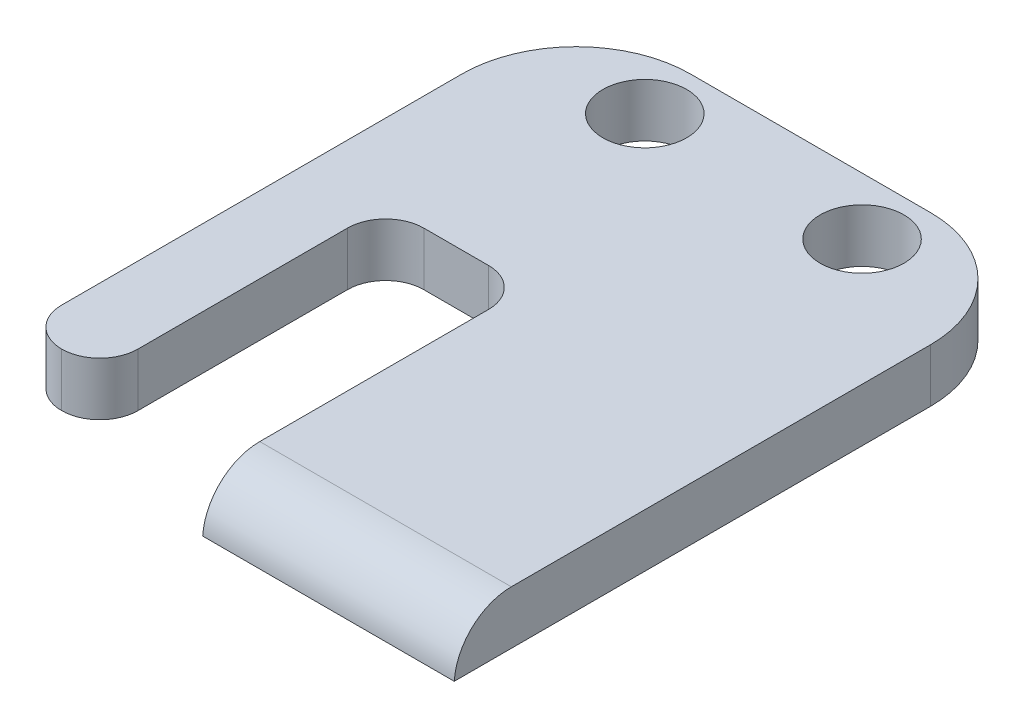
ISO-10303-21;
HEADER;
FILE_DESCRIPTION(('STEP AP214'),'2;1');
FILE_NAME('part.step','',(''),(''),'','','');
FILE_SCHEMA(('AUTOMOTIVE_DESIGN { 1 0 10303 214 1 1 1 1 }'));
ENDSEC;
DATA;
#1=APPLICATION_CONTEXT('core data for automotive mechanical design processes');
#2=APPLICATION_PROTOCOL_DEFINITION('international standard','automotive_design',2000,#1);
#3=PRODUCT_CONTEXT('',#1,'mechanical');
#4=PRODUCT('Part','Part','',(#3));
#5=PRODUCT_RELATED_PRODUCT_CATEGORY('part','',(#4));
#6=PRODUCT_DEFINITION_FORMATION('','',#4);
#7=PRODUCT_DEFINITION_CONTEXT('part definition',#1,'design');
#8=PRODUCT_DEFINITION('design','',#6,#7);
#9=PRODUCT_DEFINITION_SHAPE('','',#8);
#10=(LENGTH_UNIT() NAMED_UNIT(*) SI_UNIT(.MILLI.,.METRE.));
#11=(NAMED_UNIT(*) PLANE_ANGLE_UNIT() SI_UNIT($,.RADIAN.));
#12=(NAMED_UNIT(*) SI_UNIT($,.STERADIAN.) SOLID_ANGLE_UNIT());
#13=UNCERTAINTY_MEASURE_WITH_UNIT(LENGTH_MEASURE(1.E-05),#10,'distance_accuracy_value','');
#14=(GEOMETRIC_REPRESENTATION_CONTEXT(3) GLOBAL_UNCERTAINTY_ASSIGNED_CONTEXT((#13)) GLOBAL_UNIT_ASSIGNED_CONTEXT((#10,
#11,#12)) REPRESENTATION_CONTEXT('',''));
#15=CARTESIAN_POINT('',(0.,0.,0.));
#16=DIRECTION('',(0.,0.,1.));
#17=DIRECTION('',(1.,0.,0.));
#18=AXIS2_PLACEMENT_3D('',#15,#16,#17);
#19=CARTESIAN_POINT('',(0.,0.,0.));
#20=DIRECTION('',(0.,1.,0.));
#21=DIRECTION('',(0.,0.,1.));
#22=AXIS2_PLACEMENT_3D('',#19,#20,#21);
#23=PLANE('',#22);
#24=DIRECTION('',(0.,0.,-1.));
#25=VECTOR('',#24,1.);
#26=CARTESIAN_POINT('',(-12.6357076905754,0.,7.37612543632473));
#27=LINE('',#26,#25);
#28=CARTESIAN_POINT('',(-12.6357076905754,0.,20.3761254363247));
#29=VERTEX_POINT('',#28);
#30=CARTESIAN_POINT('',(-12.6357076905754,0.,9.37612543632473));
#31=VERTEX_POINT('',#30);
#32=EDGE_CURVE('E234',#29,#31,#27,.T.);
#33=ORIENTED_EDGE('',*,*,#32,.F.);
#34=CARTESIAN_POINT('',(-14.6357076905754,0.,20.3761254363247));
#35=DIRECTION('',(0.,1.,0.));
#36=DIRECTION('',(0.,0.,1.));
#37=AXIS2_PLACEMENT_3D('',#34,#35,#36);
#38=CIRCLE('',#37,2.);
#39=CARTESIAN_POINT('',(-14.6357076905754,0.,22.3761254363247));
#40=VERTEX_POINT('',#39);
#41=EDGE_CURVE('E312',#29,#40,#38,.F.);
#42=ORIENTED_EDGE('',*,*,#41,.T.);
#43=CARTESIAN_POINT('',(-14.6357076905754,0.,20.3761254363247));
#44=DIRECTION('',(0.,1.,0.));
#45=DIRECTION('',(0.,0.,1.));
#46=AXIS2_PLACEMENT_3D('',#43,#44,#45);
#47=CIRCLE('',#46,2.);
#48=CARTESIAN_POINT('',(-16.6357076905754,0.,20.3761254363247));
#49=VERTEX_POINT('',#48);
#50=EDGE_CURVE('E309',#40,#49,#47,.F.);
#51=ORIENTED_EDGE('',*,*,#50,.T.);
#52=DIRECTION('',(0.,0.,1.));
#53=VECTOR('',#52,1.);
#54=CARTESIAN_POINT('',(-16.6357076905754,0.,-6.62387456367526));
#55=LINE('',#54,#53);
#56=CARTESIAN_POINT('',(-16.6357076905754,0.,-0.623874563675265));
#57=VERTEX_POINT('',#56);
#58=EDGE_CURVE('E211',#57,#49,#55,.T.);
#59=ORIENTED_EDGE('',*,*,#58,.F.);
#60=CARTESIAN_POINT('',(-10.6357076905754,0.,-0.623874563675264));
#61=DIRECTION('',(0.,1.,0.));
#62=DIRECTION('',(0.,0.,1.));
#63=AXIS2_PLACEMENT_3D('',#60,#61,#62);
#64=CIRCLE('',#63,6.);
#65=CARTESIAN_POINT('',(-10.6357076905754,0.,-6.62387456367526));
#66=VERTEX_POINT('',#65);
#67=EDGE_CURVE('E275',#57,#66,#64,.F.);
#68=ORIENTED_EDGE('',*,*,#67,.T.);
#69=DIRECTION('',(-1.,0.,0.));
#70=VECTOR('',#69,1.);
#71=CARTESIAN_POINT('',(-16.6357076905754,0.,-6.62387456367526));
#72=LINE('',#71,#70);
#73=CARTESIAN_POINT('',(1.96429230942462,0.,-6.62387456367526));
#74=VERTEX_POINT('',#73);
#75=EDGE_CURVE('E254',#74,#66,#72,.T.);
#76=ORIENTED_EDGE('',*,*,#75,.F.);
#77=CARTESIAN_POINT('',(1.96429230942462,0.,-0.623874563675264));
#78=DIRECTION('',(0.,1.,0.));
#79=DIRECTION('',(0.,0.,1.));
#80=AXIS2_PLACEMENT_3D('',#77,#78,#79);
#81=CIRCLE('',#80,6.);
#82=CARTESIAN_POINT('',(7.96429230942462,0.,-0.623874563675264));
#83=VERTEX_POINT('',#82);
#84=EDGE_CURVE('E273',#74,#83,#81,.F.);
#85=ORIENTED_EDGE('',*,*,#84,.T.);
#86=DIRECTION('',(0.,0.,-1.));
#87=VECTOR('',#86,1.);
#88=CARTESIAN_POINT('',(7.96429230942462,0.,-6.62387456367526));
#89=LINE('',#88,#87);
#90=CARTESIAN_POINT('',(7.96429230942463,0.,24.3761254363247));
#91=VERTEX_POINT('',#90);
#92=EDGE_CURVE('E248',#91,#83,#89,.T.);
#93=ORIENTED_EDGE('',*,*,#92,.F.);
#94=DIRECTION('',(1.,0.,0.));
#95=VECTOR('',#94,1.);
#96=CARTESIAN_POINT('',(-5.23570769057537,0.,24.3761254363247));
#97=LINE('',#96,#95);
#98=CARTESIAN_POINT('',(-5.23570769057537,0.,24.3761254363247));
#99=VERTEX_POINT('',#98);
#100=EDGE_CURVE('E246',#99,#91,#97,.T.);
#101=ORIENTED_EDGE('',*,*,#100,.F.);
#102=DIRECTION('',(0.,0.,1.));
#103=VECTOR('',#102,1.);
#104=CARTESIAN_POINT('',(-5.23570769057537,0.,7.37612543632473));
#105=LINE('',#104,#103);
#106=CARTESIAN_POINT('',(-5.23570769057537,0.,9.37612543632473));
#107=VERTEX_POINT('',#106);
#108=EDGE_CURVE('E243',#107,#99,#105,.T.);
#109=ORIENTED_EDGE('',*,*,#108,.F.);
#110=CARTESIAN_POINT('',(-7.23570769057537,0.,9.37612543632473));
#111=DIRECTION('',(0.,1.,0.));
#112=DIRECTION('',(0.,0.,1.));
#113=AXIS2_PLACEMENT_3D('',#110,#111,#112);
#114=CIRCLE('',#113,2.);
#115=CARTESIAN_POINT('',(-7.23570769057537,0.,7.37612543632473));
#116=VERTEX_POINT('',#115);
#117=EDGE_CURVE('E321',#107,#116,#114,.T.);
#118=ORIENTED_EDGE('',*,*,#117,.T.);
#119=DIRECTION('',(1.,0.,0.));
#120=VECTOR('',#119,1.);
#121=CARTESIAN_POINT('',(-5.23570769057537,0.,7.37612543632473));
#122=LINE('',#121,#120);
#123=CARTESIAN_POINT('',(-10.6357076905754,0.,7.37612543632473));
#124=VERTEX_POINT('',#123);
#125=EDGE_CURVE('E238',#124,#116,#122,.T.);
#126=ORIENTED_EDGE('',*,*,#125,.F.);
#127=CARTESIAN_POINT('',(-10.6357076905754,0.,9.37612543632473));
#128=DIRECTION('',(0.,1.,0.));
#129=DIRECTION('',(0.,0.,1.));
#130=AXIS2_PLACEMENT_3D('',#127,#128,#129);
#131=CIRCLE('',#130,2.);
#132=EDGE_CURVE('E333',#124,#31,#131,.T.);
#133=ORIENTED_EDGE('',*,*,#132,.T.);
#134=EDGE_LOOP('',(#33,#42,#51,#59,#68,#76,#85,#93,#101,#109,#118,#126,#133));
#135=FACE_BOUND('',#134,.T.);
#136=CARTESIAN_POINT('',(1.36429230942463,0.,-3.62387456367527));
#137=DIRECTION('',(0.,1.,0.));
#138=DIRECTION('',(0.,0.,1.));
#139=AXIS2_PLACEMENT_3D('',#136,#137,#138);
#140=CIRCLE('',#139,2.2);
#141=CARTESIAN_POINT('',(1.36429230942463,0.,-1.42387456367527));
#142=VERTEX_POINT('',#141);
#143=EDGE_CURVE('E207',#142,#142,#140,.T.);
#144=ORIENTED_EDGE('',*,*,#143,.T.);
#145=EDGE_LOOP('',(#144));
#146=FACE_BOUND('',#145,.T.);
#147=CARTESIAN_POINT('',(-10.0357076905754,0.,-3.62387456367527));
#148=DIRECTION('',(0.,1.,0.));
#149=DIRECTION('',(0.,0.,1.));
#150=AXIS2_PLACEMENT_3D('',#147,#148,#149);
#151=CIRCLE('',#150,2.2);
#152=CARTESIAN_POINT('',(-10.0357076905754,0.,-1.42387456367527));
#153=VERTEX_POINT('',#152);
#154=EDGE_CURVE('E237',#153,#153,#151,.T.);
#155=ORIENTED_EDGE('',*,*,#154,.T.);
#156=EDGE_LOOP('',(#155));
#157=FACE_BOUND('',#156,.T.);
#158=DIRECTION('',(0.,0.,1.));
#159=VECTOR('',#158,1.);
#160=CARTESIAN_POINT('',(-3.03570769057537,0.,0.));
#161=LINE('',#160,#159);
#162=CARTESIAN_POINT('',(-3.03570769057537,0.,3.37612543632474));
#163=VERTEX_POINT('',#162);
#164=CARTESIAN_POINT('',(-3.03570769057537,0.,14.5761254363247));
#165=VERTEX_POINT('',#164);
#166=EDGE_CURVE('E584',#163,#165,#161,.T.);
#167=ORIENTED_EDGE('',*,*,#166,.T.);
#168=DIRECTION('',(1.,0.,0.));
#169=VECTOR('',#168,1.);
#170=CARTESIAN_POINT('',(0.,0.,14.5761254363247));
#171=LINE('',#170,#169);
#172=CARTESIAN_POINT('',(5.96429230942463,0.,14.5761254363247));
#173=VERTEX_POINT('',#172);
#174=EDGE_CURVE('E187',#165,#173,#171,.T.);
#175=ORIENTED_EDGE('',*,*,#174,.T.);
#176=DIRECTION('',(0.,0.,-1.));
#177=VECTOR('',#176,1.);
#178=CARTESIAN_POINT('',(5.96429230942463,0.,0.));
#179=LINE('',#178,#177);
#180=CARTESIAN_POINT('',(5.96429230942463,0.,3.37612543632474));
#181=VERTEX_POINT('',#180);
#182=EDGE_CURVE('E574',#173,#181,#179,.T.);
#183=ORIENTED_EDGE('',*,*,#182,.T.);
#184=DIRECTION('',(-1.,0.,0.));
#185=VECTOR('',#184,1.);
#186=CARTESIAN_POINT('',(0.,0.,3.37612543632474));
#187=LINE('',#186,#185);
#188=EDGE_CURVE('E185',#181,#163,#187,.T.);
#189=ORIENTED_EDGE('',*,*,#188,.T.);
#190=EDGE_LOOP('',(#167,#175,#183,#189));
#191=FACE_BOUND('',#190,.T.);
#192=ADVANCED_FACE('F43',(#135,#146,#157,#191),#23,.F.);
#193=CARTESIAN_POINT('',(-12.6357076905754,2.8,7.37612543632473));
#194=DIRECTION('',(-1.,0.,0.));
#195=DIRECTION('',(0.,0.,1.));
#196=AXIS2_PLACEMENT_3D('',#193,#194,#195);
#197=PLANE('',#196);
#198=ORIENTED_EDGE('',*,*,#32,.T.);
#199=DIRECTION('',(0.,-1.,0.));
#200=VECTOR('',#199,1.);
#201=CARTESIAN_POINT('',(-12.6357076905754,2.8,9.37612543632473));
#202=LINE('',#201,#200);
#203=CARTESIAN_POINT('',(-12.6357076905754,2.8,9.37612543632473));
#204=VERTEX_POINT('',#203);
#205=EDGE_CURVE('E310',#31,#204,#202,.F.);
#206=ORIENTED_EDGE('',*,*,#205,.T.);
#207=DIRECTION('',(0.,0.,-1.));
#208=VECTOR('',#207,1.);
#209=CARTESIAN_POINT('',(-12.6357076905754,2.8,7.37612543632473));
#210=LINE('',#209,#208);
#211=CARTESIAN_POINT('',(-12.6357076905754,2.8,20.3761254363247));
#212=VERTEX_POINT('',#211);
#213=EDGE_CURVE('E208',#212,#204,#210,.T.);
#214=ORIENTED_EDGE('',*,*,#213,.F.);
#215=DIRECTION('',(0.,-1.,0.));
#216=VECTOR('',#215,1.);
#217=CARTESIAN_POINT('',(-12.6357076905754,2.8,20.3761254363247));
#218=LINE('',#217,#216);
#219=EDGE_CURVE('E303',#212,#29,#218,.T.);
#220=ORIENTED_EDGE('',*,*,#219,.T.);
#221=EDGE_LOOP('',(#198,#206,#214,#220));
#222=FACE_BOUND('',#221,.T.);
#223=ADVANCED_FACE('F368',(#222),#197,.F.);
#224=CARTESIAN_POINT('',(-5.23570769057537,2.8,7.37612543632473));
#225=DIRECTION('',(0.,0.,-1.));
#226=DIRECTION('',(-1.,0.,0.));
#227=AXIS2_PLACEMENT_3D('',#224,#225,#226);
#228=PLANE('',#227);
#229=ORIENTED_EDGE('',*,*,#125,.T.);
#230=DIRECTION('',(0.,-1.,0.));
#231=VECTOR('',#230,1.);
#232=CARTESIAN_POINT('',(-7.23570769057537,2.8,7.37612543632473));
#233=LINE('',#232,#231);
#234=CARTESIAN_POINT('',(-7.23570769057537,2.8,7.37612543632473));
#235=VERTEX_POINT('',#234);
#236=EDGE_CURVE('E297',#116,#235,#233,.F.);
#237=ORIENTED_EDGE('',*,*,#236,.T.);
#238=DIRECTION('',(1.,0.,0.));
#239=VECTOR('',#238,1.);
#240=CARTESIAN_POINT('',(-5.23570769057537,2.8,7.37612543632473));
#241=LINE('',#240,#239);
#242=CARTESIAN_POINT('',(-10.6357076905754,2.8,7.37612543632473));
#243=VERTEX_POINT('',#242);
#244=EDGE_CURVE('E215',#243,#235,#241,.T.);
#245=ORIENTED_EDGE('',*,*,#244,.F.);
#246=DIRECTION('',(0.,-1.,0.));
#247=VECTOR('',#246,1.);
#248=CARTESIAN_POINT('',(-10.6357076905754,0.,7.37612543632473));
#249=LINE('',#248,#247);
#250=EDGE_CURVE('E298',#243,#124,#249,.T.);
#251=ORIENTED_EDGE('',*,*,#250,.T.);
#252=EDGE_LOOP('',(#229,#237,#245,#251));
#253=FACE_BOUND('',#252,.T.);
#254=ADVANCED_FACE('F359',(#253),#228,.F.);
#255=CARTESIAN_POINT('',(-5.23570769057537,2.8,7.37612543632473));
#256=DIRECTION('',(1.,0.,0.));
#257=DIRECTION('',(0.,0.,-1.));
#258=AXIS2_PLACEMENT_3D('',#255,#256,#257);
#259=PLANE('',#258);
#260=ORIENTED_EDGE('',*,*,#108,.T.);
#261=CARTESIAN_POINT('',(-5.23570769057537,-0.2,21.3827995269056));
#262=DIRECTION('',(1.,0.,0.));
#263=DIRECTION('',(0.,0.,-1.));
#264=AXIS2_PLACEMENT_3D('',#261,#262,#263);
#265=CIRCLE('',#264,3.);
#266=CARTESIAN_POINT('',(-5.23570769057537,2.8,21.3827995269056));
#267=VERTEX_POINT('',#266);
#268=EDGE_CURVE('E11',#99,#267,#265,.F.);
#269=ORIENTED_EDGE('',*,*,#268,.T.);
#270=DIRECTION('',(0.,0.,1.));
#271=VECTOR('',#270,1.);
#272=CARTESIAN_POINT('',(-5.23570769057537,2.8,7.37612543632473));
#273=LINE('',#272,#271);
#274=CARTESIAN_POINT('',(-5.23570769057537,2.8,9.37612543632473));
#275=VERTEX_POINT('',#274);
#276=EDGE_CURVE('E217',#275,#267,#273,.T.);
#277=ORIENTED_EDGE('',*,*,#276,.F.);
#278=DIRECTION('',(0.,-1.,0.));
#279=VECTOR('',#278,1.);
#280=CARTESIAN_POINT('',(-5.23570769057537,0.,9.37612543632473));
#281=LINE('',#280,#279);
#282=EDGE_CURVE('E292',#275,#107,#281,.T.);
#283=ORIENTED_EDGE('',*,*,#282,.T.);
#284=EDGE_LOOP('',(#260,#269,#277,#283));
#285=FACE_BOUND('',#284,.T.);
#286=ADVANCED_FACE('F352',(#285),#259,.F.);
#287=CARTESIAN_POINT('',(7.96429230942462,2.8,-6.62387456367526));
#288=DIRECTION('',(-1.,0.,0.));
#289=DIRECTION('',(0.,0.,1.));
#290=AXIS2_PLACEMENT_3D('',#287,#288,#289);
#291=PLANE('',#290);
#292=DIRECTION('',(0.,0.,-1.));
#293=VECTOR('',#292,1.);
#294=CARTESIAN_POINT('',(7.96429230942462,2.8,-6.62387456367526));
#295=LINE('',#294,#293);
#296=CARTESIAN_POINT('',(7.96429230942463,2.8,21.3827995269056));
#297=VERTEX_POINT('',#296);
#298=CARTESIAN_POINT('',(7.96429230942462,2.8,-0.623874563675264));
#299=VERTEX_POINT('',#298);
#300=EDGE_CURVE('E225',#297,#299,#295,.T.);
#301=ORIENTED_EDGE('',*,*,#300,.F.);
#302=CARTESIAN_POINT('',(7.96429230942463,-0.2,21.3827995269056));
#303=DIRECTION('',(-1.,0.,0.));
#304=DIRECTION('',(0.,0.,1.));
#305=AXIS2_PLACEMENT_3D('',#302,#303,#304);
#306=CIRCLE('',#305,3.);
#307=EDGE_CURVE('E55',#297,#91,#306,.F.);
#308=ORIENTED_EDGE('',*,*,#307,.T.);
#309=ORIENTED_EDGE('',*,*,#92,.T.);
#310=DIRECTION('',(0.,-1.,0.));
#311=VECTOR('',#310,1.);
#312=CARTESIAN_POINT('',(7.96429230942462,2.8,-0.623874563675264));
#313=LINE('',#312,#311);
#314=EDGE_CURVE('E277',#83,#299,#313,.F.);
#315=ORIENTED_EDGE('',*,*,#314,.T.);
#316=EDGE_LOOP('',(#301,#308,#309,#315));
#317=FACE_BOUND('',#316,.T.);
#318=ADVANCED_FACE('F344',(#317),#291,.F.);
#319=CARTESIAN_POINT('',(-16.6357076905754,2.8,-6.62387456367526));
#320=DIRECTION('',(0.,0.,1.));
#321=DIRECTION('',(1.,0.,0.));
#322=AXIS2_PLACEMENT_3D('',#319,#320,#321);
#323=PLANE('',#322);
#324=DIRECTION('',(-1.,0.,0.));
#325=VECTOR('',#324,1.);
#326=CARTESIAN_POINT('',(-16.6357076905754,2.8,-6.62387456367526));
#327=LINE('',#326,#325);
#328=CARTESIAN_POINT('',(1.96429230942462,2.8,-6.62387456367526));
#329=VERTEX_POINT('',#328);
#330=CARTESIAN_POINT('',(-10.6357076905754,2.8,-6.62387456367526));
#331=VERTEX_POINT('',#330);
#332=EDGE_CURVE('E224',#329,#331,#327,.T.);
#333=ORIENTED_EDGE('',*,*,#332,.F.);
#334=DIRECTION('',(0.,-1.,0.));
#335=VECTOR('',#334,1.);
#336=CARTESIAN_POINT('',(1.96429230942462,2.8,-6.62387456367526));
#337=LINE('',#336,#335);
#338=EDGE_CURVE('E266',#329,#74,#337,.T.);
#339=ORIENTED_EDGE('',*,*,#338,.T.);
#340=ORIENTED_EDGE('',*,*,#75,.T.);
#341=DIRECTION('',(0.,-1.,0.));
#342=VECTOR('',#341,1.);
#343=CARTESIAN_POINT('',(-10.6357076905754,2.8,-6.62387456367526));
#344=LINE('',#343,#342);
#345=EDGE_CURVE('E231',#66,#331,#344,.F.);
#346=ORIENTED_EDGE('',*,*,#345,.T.);
#347=EDGE_LOOP('',(#333,#339,#340,#346));
#348=FACE_BOUND('',#347,.T.);
#349=ADVANCED_FACE('F393',(#348),#323,.F.);
#350=CARTESIAN_POINT('',(-16.6357076905754,2.8,-6.62387456367526));
#351=DIRECTION('',(1.,0.,0.));
#352=DIRECTION('',(0.,0.,-1.));
#353=AXIS2_PLACEMENT_3D('',#350,#351,#352);
#354=PLANE('',#353);
#355=ORIENTED_EDGE('',*,*,#58,.T.);
#356=DIRECTION('',(0.,-1.,0.));
#357=VECTOR('',#356,1.);
#358=CARTESIAN_POINT('',(-16.6357076905754,2.8,20.3761254363247));
#359=LINE('',#358,#357);
#360=CARTESIAN_POINT('',(-16.6357076905754,2.8,20.3761254363247));
#361=VERTEX_POINT('',#360);
#362=EDGE_CURVE('E324',#49,#361,#359,.F.);
#363=ORIENTED_EDGE('',*,*,#362,.T.);
#364=DIRECTION('',(0.,0.,1.));
#365=VECTOR('',#364,1.);
#366=CARTESIAN_POINT('',(-16.6357076905754,2.8,-6.62387456367526));
#367=LINE('',#366,#365);
#368=CARTESIAN_POINT('',(-16.6357076905754,2.8,-0.623874563675265));
#369=VERTEX_POINT('',#368);
#370=EDGE_CURVE('E230',#369,#361,#367,.T.);
#371=ORIENTED_EDGE('',*,*,#370,.F.);
#372=DIRECTION('',(0.,-1.,0.));
#373=VECTOR('',#372,1.);
#374=CARTESIAN_POINT('',(-16.6357076905754,2.8,-0.623874563675264));
#375=LINE('',#374,#373);
#376=EDGE_CURVE('E286',#369,#57,#375,.T.);
#377=ORIENTED_EDGE('',*,*,#376,.T.);
#378=EDGE_LOOP('',(#355,#363,#371,#377));
#379=FACE_BOUND('',#378,.T.);
#380=ADVANCED_FACE('F384',(#379),#354,.F.);
#381=CARTESIAN_POINT('',(0.,2.8,0.));
#382=DIRECTION('',(0.,1.,0.));
#383=DIRECTION('',(0.,0.,1.));
#384=AXIS2_PLACEMENT_3D('',#381,#382,#383);
#385=PLANE('',#384);
#386=CARTESIAN_POINT('',(-10.0357076905754,2.8,-3.62387456367527));
#387=DIRECTION('',(0.,1.,0.));
#388=DIRECTION('',(0.,0.,1.));
#389=AXIS2_PLACEMENT_3D('',#386,#387,#388);
#390=CIRCLE('',#389,2.2);
#391=CARTESIAN_POINT('',(-10.0357076905754,2.8,-1.42387456367527));
#392=VERTEX_POINT('',#391);
#393=EDGE_CURVE('E205',#392,#392,#390,.T.);
#394=ORIENTED_EDGE('',*,*,#393,.F.);
#395=EDGE_LOOP('',(#394));
#396=FACE_BOUND('',#395,.T.);
#397=CARTESIAN_POINT('',(1.36429230942463,2.8,-3.62387456367527));
#398=DIRECTION('',(0.,1.,0.));
#399=DIRECTION('',(0.,0.,1.));
#400=AXIS2_PLACEMENT_3D('',#397,#398,#399);
#401=CIRCLE('',#400,2.2);
#402=CARTESIAN_POINT('',(1.36429230942463,2.8,-1.42387456367527));
#403=VERTEX_POINT('',#402);
#404=EDGE_CURVE('E191',#403,#403,#401,.T.);
#405=ORIENTED_EDGE('',*,*,#404,.F.);
#406=EDGE_LOOP('',(#405));
#407=FACE_BOUND('',#406,.T.);
#408=ORIENTED_EDGE('',*,*,#276,.T.);
#409=DIRECTION('',(-1.,0.,0.));
#410=VECTOR('',#409,1.);
#411=CARTESIAN_POINT('',(7.96429230942463,2.8,21.3827995269056));
#412=LINE('',#411,#410);
#413=EDGE_CURVE('E334',#267,#297,#412,.F.);
#414=ORIENTED_EDGE('',*,*,#413,.T.);
#415=ORIENTED_EDGE('',*,*,#300,.T.);
#416=CARTESIAN_POINT('',(1.96429230942462,2.8,-0.623874563675264));
#417=DIRECTION('',(0.,1.,0.));
#418=DIRECTION('',(0.,0.,1.));
#419=AXIS2_PLACEMENT_3D('',#416,#417,#418);
#420=CIRCLE('',#419,6.);
#421=EDGE_CURVE('E284',#299,#329,#420,.T.);
#422=ORIENTED_EDGE('',*,*,#421,.T.);
#423=ORIENTED_EDGE('',*,*,#332,.T.);
#424=CARTESIAN_POINT('',(-10.6357076905754,2.8,-0.623874563675264));
#425=DIRECTION('',(0.,1.,0.));
#426=DIRECTION('',(0.,0.,1.));
#427=AXIS2_PLACEMENT_3D('',#424,#425,#426);
#428=CIRCLE('',#427,6.);
#429=EDGE_CURVE('E285',#331,#369,#428,.T.);
#430=ORIENTED_EDGE('',*,*,#429,.T.);
#431=ORIENTED_EDGE('',*,*,#370,.T.);
#432=CARTESIAN_POINT('',(-14.6357076905754,2.8,20.3761254363247));
#433=DIRECTION('',(0.,1.,0.));
#434=DIRECTION('',(0.,0.,1.));
#435=AXIS2_PLACEMENT_3D('',#432,#433,#434);
#436=CIRCLE('',#435,2.);
#437=CARTESIAN_POINT('',(-14.6357076905754,2.8,22.3761254363247));
#438=VERTEX_POINT('',#437);
#439=EDGE_CURVE('E317',#361,#438,#436,.T.);
#440=ORIENTED_EDGE('',*,*,#439,.T.);
#441=CARTESIAN_POINT('',(-14.6357076905754,2.8,20.3761254363247));
#442=DIRECTION('',(0.,1.,0.));
#443=DIRECTION('',(0.,0.,1.));
#444=AXIS2_PLACEMENT_3D('',#441,#442,#443);
#445=CIRCLE('',#444,2.);
#446=EDGE_CURVE('E316',#438,#212,#445,.T.);
#447=ORIENTED_EDGE('',*,*,#446,.T.);
#448=ORIENTED_EDGE('',*,*,#213,.T.);
#449=CARTESIAN_POINT('',(-10.6357076905754,2.8,9.37612543632473));
#450=DIRECTION('',(0.,1.,0.));
#451=DIRECTION('',(0.,0.,1.));
#452=AXIS2_PLACEMENT_3D('',#449,#450,#451);
#453=CIRCLE('',#452,2.);
#454=EDGE_CURVE('E331',#204,#243,#453,.F.);
#455=ORIENTED_EDGE('',*,*,#454,.T.);
#456=ORIENTED_EDGE('',*,*,#244,.T.);
#457=CARTESIAN_POINT('',(-7.23570769057537,2.8,9.37612543632473));
#458=DIRECTION('',(0.,1.,0.));
#459=DIRECTION('',(0.,0.,1.));
#460=AXIS2_PLACEMENT_3D('',#457,#458,#459);
#461=CIRCLE('',#460,2.);
#462=EDGE_CURVE('E326',#235,#275,#461,.F.);
#463=ORIENTED_EDGE('',*,*,#462,.T.);
#464=EDGE_LOOP('',(#408,#414,#415,#422,#423,#430,#431,#440,#447,#448,#455,#456,#463));
#465=FACE_BOUND('',#464,.T.);
#466=ADVANCED_FACE('F353',(#396,#407,#465),#385,.T.);
#467=CARTESIAN_POINT('',(1.36429230942463,-3.2,-3.62387456367527));
#468=DIRECTION('',(0.,1.,0.));
#469=DIRECTION('',(0.,0.,1.));
#470=AXIS2_PLACEMENT_3D('',#467,#468,#469);
#471=CYLINDRICAL_SURFACE('',#470,2.2);
#472=ORIENTED_EDGE('',*,*,#404,.T.);
#473=EDGE_LOOP('',(#472));
#474=FACE_BOUND('',#473,.T.);
#475=ORIENTED_EDGE('',*,*,#143,.F.);
#476=EDGE_LOOP('',(#475));
#477=FACE_BOUND('',#476,.T.);
#478=ADVANCED_FACE('F401',(#474,#477),#471,.F.);
#479=CARTESIAN_POINT('',(-10.0357076905754,-3.2,-3.62387456367527));
#480=DIRECTION('',(0.,1.,0.));
#481=DIRECTION('',(0.,0.,1.));
#482=AXIS2_PLACEMENT_3D('',#479,#480,#481);
#483=CYLINDRICAL_SURFACE('',#482,2.2);
#484=ORIENTED_EDGE('',*,*,#393,.T.);
#485=EDGE_LOOP('',(#484));
#486=FACE_BOUND('',#485,.T.);
#487=ORIENTED_EDGE('',*,*,#154,.F.);
#488=EDGE_LOOP('',(#487));
#489=FACE_BOUND('',#488,.T.);
#490=ADVANCED_FACE('F400',(#486,#489),#483,.F.);
#491=CARTESIAN_POINT('',(1.96429230942462,2.8,-0.623874563675264));
#492=DIRECTION('',(0.,-1.,0.));
#493=DIRECTION('',(0.,0.,-1.));
#494=AXIS2_PLACEMENT_3D('',#491,#492,#493);
#495=CYLINDRICAL_SURFACE('',#494,6.);
#496=ORIENTED_EDGE('',*,*,#421,.F.);
#497=ORIENTED_EDGE('',*,*,#314,.F.);
#498=ORIENTED_EDGE('',*,*,#84,.F.);
#499=ORIENTED_EDGE('',*,*,#338,.F.);
#500=EDGE_LOOP('',(#496,#497,#498,#499));
#501=FACE_BOUND('',#500,.T.);
#502=ADVANCED_FACE('F394',(#501),#495,.T.);
#503=CARTESIAN_POINT('',(-10.6357076905754,2.8,-0.623874563675264));
#504=DIRECTION('',(0.,-1.,0.));
#505=DIRECTION('',(0.,0.,-1.));
#506=AXIS2_PLACEMENT_3D('',#503,#504,#505);
#507=CYLINDRICAL_SURFACE('',#506,6.);
#508=ORIENTED_EDGE('',*,*,#429,.F.);
#509=ORIENTED_EDGE('',*,*,#345,.F.);
#510=ORIENTED_EDGE('',*,*,#67,.F.);
#511=ORIENTED_EDGE('',*,*,#376,.F.);
#512=EDGE_LOOP('',(#508,#509,#510,#511));
#513=FACE_BOUND('',#512,.T.);
#514=ADVANCED_FACE('F390',(#513),#507,.T.);
#515=CARTESIAN_POINT('',(-7.23570769057537,2.8,9.37612543632473));
#516=DIRECTION('',(0.,1.,0.));
#517=DIRECTION('',(0.,0.,1.));
#518=AXIS2_PLACEMENT_3D('',#515,#516,#517);
#519=CYLINDRICAL_SURFACE('',#518,2.);
#520=ORIENTED_EDGE('',*,*,#462,.F.);
#521=ORIENTED_EDGE('',*,*,#236,.F.);
#522=ORIENTED_EDGE('',*,*,#117,.F.);
#523=ORIENTED_EDGE('',*,*,#282,.F.);
#524=EDGE_LOOP('',(#520,#521,#522,#523));
#525=FACE_BOUND('',#524,.T.);
#526=ADVANCED_FACE('F358',(#525),#519,.F.);
#527=CARTESIAN_POINT('',(-10.6357076905754,2.8,9.37612543632473));
#528=DIRECTION('',(0.,1.,0.));
#529=DIRECTION('',(0.,0.,1.));
#530=AXIS2_PLACEMENT_3D('',#527,#528,#529);
#531=CYLINDRICAL_SURFACE('',#530,2.);
#532=ORIENTED_EDGE('',*,*,#454,.F.);
#533=ORIENTED_EDGE('',*,*,#205,.F.);
#534=ORIENTED_EDGE('',*,*,#132,.F.);
#535=ORIENTED_EDGE('',*,*,#250,.F.);
#536=EDGE_LOOP('',(#532,#533,#534,#535));
#537=FACE_BOUND('',#536,.T.);
#538=ADVANCED_FACE('F362',(#537),#531,.F.);
#539=CARTESIAN_POINT('',(-14.6357076905754,2.8,20.3761254363247));
#540=DIRECTION('',(0.,-1.,0.));
#541=DIRECTION('',(0.,0.,-1.));
#542=AXIS2_PLACEMENT_3D('',#539,#540,#541);
#543=CYLINDRICAL_SURFACE('',#542,2.);
#544=DIRECTION('',(0.,-1.,0.));
#545=VECTOR('',#544,1.);
#546=CARTESIAN_POINT('',(-14.6357076905754,2.8,22.3761254363247));
#547=LINE('',#546,#545);
#548=EDGE_CURVE('E189',#438,#40,#547,.T.);
#549=ORIENTED_EDGE('',*,*,#548,.F.);
#550=ORIENTED_EDGE('',*,*,#439,.F.);
#551=ORIENTED_EDGE('',*,*,#362,.F.);
#552=ORIENTED_EDGE('',*,*,#50,.F.);
#553=EDGE_LOOP('',(#549,#550,#551,#552));
#554=FACE_BOUND('',#553,.T.);
#555=ADVANCED_FACE('F378',(#554),#543,.T.);
#556=CARTESIAN_POINT('',(-14.6357076905754,2.8,20.3761254363247));
#557=DIRECTION('',(0.,-1.,0.));
#558=DIRECTION('',(0.,0.,-1.));
#559=AXIS2_PLACEMENT_3D('',#556,#557,#558);
#560=CYLINDRICAL_SURFACE('',#559,2.);
#561=ORIENTED_EDGE('',*,*,#446,.F.);
#562=ORIENTED_EDGE('',*,*,#548,.T.);
#563=ORIENTED_EDGE('',*,*,#41,.F.);
#564=ORIENTED_EDGE('',*,*,#219,.F.);
#565=EDGE_LOOP('',(#561,#562,#563,#564));
#566=FACE_BOUND('',#565,.T.);
#567=ADVANCED_FACE('F373',(#566),#560,.T.);
#568=CARTESIAN_POINT('',(-3.03570769057537,2.2,0.));
#569=DIRECTION('',(1.,0.,0.));
#570=DIRECTION('',(0.,0.,-1.));
#571=AXIS2_PLACEMENT_3D('',#568,#569,#570);
#572=PLANE('',#571);
#573=ORIENTED_EDGE('',*,*,#166,.F.);
#574=DIRECTION('',(0.,-1.,0.));
#575=VECTOR('',#574,1.);
#576=CARTESIAN_POINT('',(-3.03570769057537,2.2,3.37612543632474));
#577=LINE('',#576,#575);
#578=CARTESIAN_POINT('',(-3.03570769057537,2.2,3.37612543632474));
#579=VERTEX_POINT('',#578);
#580=EDGE_CURVE('E179',#579,#163,#577,.T.);
#581=ORIENTED_EDGE('',*,*,#580,.F.);
#582=DIRECTION('',(0.,0.,1.));
#583=VECTOR('',#582,1.);
#584=CARTESIAN_POINT('',(-3.03570769057537,2.2,0.));
#585=LINE('',#584,#583);
#586=CARTESIAN_POINT('',(-3.03570769057537,2.2,14.5761254363247));
#587=VERTEX_POINT('',#586);
#588=EDGE_CURVE('E168',#579,#587,#585,.T.);
#589=ORIENTED_EDGE('',*,*,#588,.T.);
#590=DIRECTION('',(0.,-1.,0.));
#591=VECTOR('',#590,1.);
#592=CARTESIAN_POINT('',(-3.03570769057537,2.2,14.5761254363247));
#593=LINE('',#592,#591);
#594=EDGE_CURVE('E180',#587,#165,#593,.T.);
#595=ORIENTED_EDGE('',*,*,#594,.T.);
#596=EDGE_LOOP('',(#573,#581,#589,#595));
#597=FACE_BOUND('',#596,.T.);
#598=ADVANCED_FACE('F176',(#597),#572,.T.);
#599=CARTESIAN_POINT('',(0.,2.2,14.5761254363247));
#600=DIRECTION('',(0.,0.,-1.));
#601=DIRECTION('',(-1.,0.,0.));
#602=AXIS2_PLACEMENT_3D('',#599,#600,#601);
#603=PLANE('',#602);
#604=ORIENTED_EDGE('',*,*,#174,.F.);
#605=ORIENTED_EDGE('',*,*,#594,.F.);
#606=DIRECTION('',(1.,0.,0.));
#607=VECTOR('',#606,1.);
#608=CARTESIAN_POINT('',(0.,2.2,14.5761254363247));
#609=LINE('',#608,#607);
#610=CARTESIAN_POINT('',(5.96429230942463,2.2,14.5761254363247));
#611=VERTEX_POINT('',#610);
#612=EDGE_CURVE('E162',#587,#611,#609,.T.);
#613=ORIENTED_EDGE('',*,*,#612,.T.);
#614=DIRECTION('',(0.,-1.,0.));
#615=VECTOR('',#614,1.);
#616=CARTESIAN_POINT('',(5.96429230942463,2.2,14.5761254363247));
#617=LINE('',#616,#615);
#618=EDGE_CURVE('E186',#611,#173,#617,.T.);
#619=ORIENTED_EDGE('',*,*,#618,.T.);
#620=EDGE_LOOP('',(#604,#605,#613,#619));
#621=FACE_BOUND('',#620,.T.);
#622=ADVANCED_FACE('F183',(#621),#603,.T.);
#623=CARTESIAN_POINT('',(5.96429230942463,2.2,0.));
#624=DIRECTION('',(-1.,0.,0.));
#625=DIRECTION('',(0.,0.,1.));
#626=AXIS2_PLACEMENT_3D('',#623,#624,#625);
#627=PLANE('',#626);
#628=ORIENTED_EDGE('',*,*,#182,.F.);
#629=ORIENTED_EDGE('',*,*,#618,.F.);
#630=DIRECTION('',(0.,0.,-1.));
#631=VECTOR('',#630,1.);
#632=CARTESIAN_POINT('',(5.96429230942463,2.2,0.));
#633=LINE('',#632,#631);
#634=CARTESIAN_POINT('',(5.96429230942463,2.2,3.37612543632474));
#635=VERTEX_POINT('',#634);
#636=EDGE_CURVE('E170',#611,#635,#633,.T.);
#637=ORIENTED_EDGE('',*,*,#636,.T.);
#638=DIRECTION('',(0.,-1.,0.));
#639=VECTOR('',#638,1.);
#640=CARTESIAN_POINT('',(5.96429230942463,2.2,3.37612543632474));
#641=LINE('',#640,#639);
#642=EDGE_CURVE('E196',#635,#181,#641,.T.);
#643=ORIENTED_EDGE('',*,*,#642,.T.);
#644=EDGE_LOOP('',(#628,#629,#637,#643));
#645=FACE_BOUND('',#644,.T.);
#646=ADVANCED_FACE('F527',(#645),#627,.T.);
#647=CARTESIAN_POINT('',(0.,2.2,3.37612543632474));
#648=DIRECTION('',(0.,0.,1.));
#649=DIRECTION('',(1.,0.,0.));
#650=AXIS2_PLACEMENT_3D('',#647,#648,#649);
#651=PLANE('',#650);
#652=ORIENTED_EDGE('',*,*,#188,.F.);
#653=ORIENTED_EDGE('',*,*,#642,.F.);
#654=DIRECTION('',(-1.,0.,0.));
#655=VECTOR('',#654,1.);
#656=CARTESIAN_POINT('',(0.,2.2,3.37612543632474));
#657=LINE('',#656,#655);
#658=EDGE_CURVE('E590',#635,#579,#657,.T.);
#659=ORIENTED_EDGE('',*,*,#658,.T.);
#660=ORIENTED_EDGE('',*,*,#580,.T.);
#661=EDGE_LOOP('',(#652,#653,#659,#660));
#662=FACE_BOUND('',#661,.T.);
#663=ADVANCED_FACE('F540',(#662),#651,.T.);
#664=CARTESIAN_POINT('',(0.,2.2,0.));
#665=DIRECTION('',(0.,1.,0.));
#666=DIRECTION('',(0.,0.,1.));
#667=AXIS2_PLACEMENT_3D('',#664,#665,#666);
#668=PLANE('',#667);
#669=ORIENTED_EDGE('',*,*,#588,.F.);
#670=ORIENTED_EDGE('',*,*,#658,.F.);
#671=ORIENTED_EDGE('',*,*,#636,.F.);
#672=ORIENTED_EDGE('',*,*,#612,.F.);
#673=EDGE_LOOP('',(#669,#670,#671,#672));
#674=FACE_BOUND('',#673,.T.);
#675=ADVANCED_FACE('F165',(#674),#668,.F.);
#676=CARTESIAN_POINT('',(-5.23570769057537,-0.2,21.3827995269056));
#677=DIRECTION('',(1.,0.,0.));
#678=DIRECTION('',(0.,0.,-1.));
#679=AXIS2_PLACEMENT_3D('',#676,#677,#678);
#680=CYLINDRICAL_SURFACE('',#679,3.);
#681=ORIENTED_EDGE('',*,*,#268,.F.);
#682=ORIENTED_EDGE('',*,*,#100,.T.);
#683=ORIENTED_EDGE('',*,*,#307,.F.);
#684=ORIENTED_EDGE('',*,*,#413,.F.);
#685=EDGE_LOOP('',(#681,#682,#683,#684));
#686=FACE_BOUND('',#685,.T.);
#687=ADVANCED_FACE('F44',(#686),#680,.T.);
#688=CLOSED_SHELL('',(#192,#223,#254,#286,#318,#349,#380,#466,#478,#490,#502,#514,#526,#538,
#555,#567,#598,#622,#646,#663,#675,#687));
#689=MANIFOLD_SOLID_BREP('B2',#688);
#690=ADVANCED_BREP_SHAPE_REPRESENTATION('',(#18,#689),#14);
#691=SHAPE_DEFINITION_REPRESENTATION(#9,#690);
ENDSEC;
END-ISO-10303-21;
